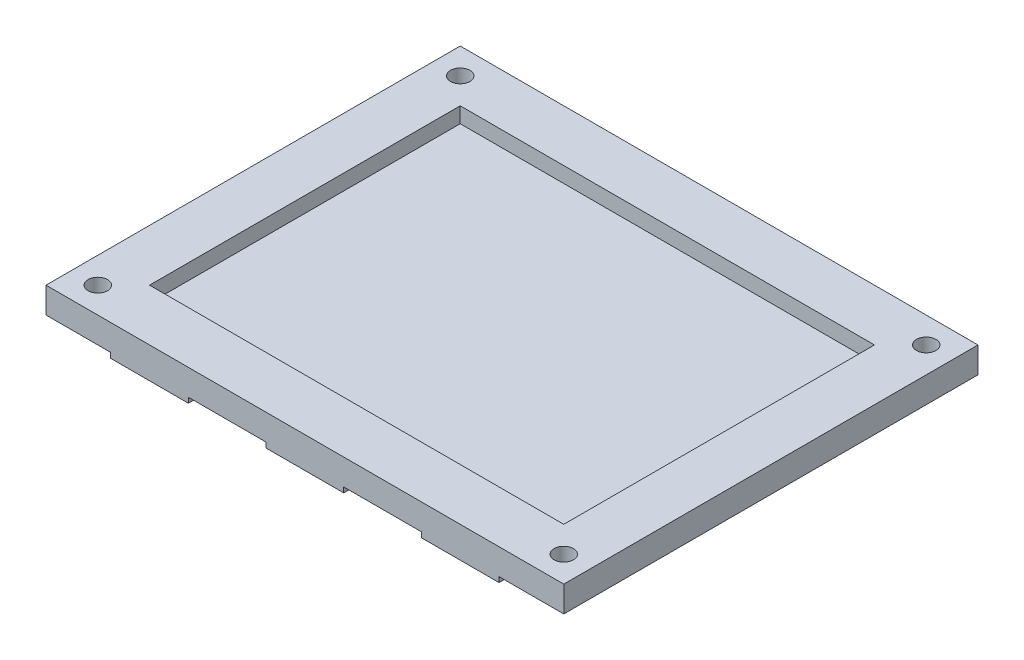
ISO-10303-21;
HEADER;
FILE_DESCRIPTION(('STEP AP214'),'2;1');
FILE_NAME('part.step','',(''),(''),'','','');
FILE_SCHEMA(('AUTOMOTIVE_DESIGN { 1 0 10303 214 1 1 1 1 }'));
ENDSEC;
DATA;
#1=APPLICATION_CONTEXT('core data for automotive mechanical design processes');
#2=APPLICATION_PROTOCOL_DEFINITION('international standard','automotive_design',2000,#1);
#3=PRODUCT_CONTEXT('',#1,'mechanical');
#4=PRODUCT('Part','Part','',(#3));
#5=PRODUCT_RELATED_PRODUCT_CATEGORY('part','',(#4));
#6=PRODUCT_DEFINITION_FORMATION('','',#4);
#7=PRODUCT_DEFINITION_CONTEXT('part definition',#1,'design');
#8=PRODUCT_DEFINITION('design','',#6,#7);
#9=PRODUCT_DEFINITION_SHAPE('','',#8);
#10=(LENGTH_UNIT() NAMED_UNIT(*) SI_UNIT(.MILLI.,.METRE.));
#11=(NAMED_UNIT(*) PLANE_ANGLE_UNIT() SI_UNIT($,.RADIAN.));
#12=(NAMED_UNIT(*) SI_UNIT($,.STERADIAN.) SOLID_ANGLE_UNIT());
#13=UNCERTAINTY_MEASURE_WITH_UNIT(LENGTH_MEASURE(1.E-05),#10,'distance_accuracy_value','');
#14=(GEOMETRIC_REPRESENTATION_CONTEXT(3) GLOBAL_UNCERTAINTY_ASSIGNED_CONTEXT((#13)) GLOBAL_UNIT_ASSIGNED_CONTEXT((#10,
#11,#12)) REPRESENTATION_CONTEXT('',''));
#15=CARTESIAN_POINT('',(0.,0.,0.));
#16=DIRECTION('',(0.,0.,1.));
#17=DIRECTION('',(1.,0.,0.));
#18=AXIS2_PLACEMENT_3D('',#15,#16,#17);
#19=CARTESIAN_POINT('',(0.,0.,0.));
#20=DIRECTION('',(0.,1.,0.));
#21=DIRECTION('',(0.,0.,1.));
#22=AXIS2_PLACEMENT_3D('',#19,#20,#21);
#23=PLANE('',#22);
#24=DIRECTION('',(0.,0.,1.));
#25=VECTOR('',#24,1.);
#26=CARTESIAN_POINT('',(-45.,0.,80.));
#27=LINE('',#26,#25);
#28=CARTESIAN_POINT('',(-45.,0.,-80.));
#29=VERTEX_POINT('',#28);
#30=CARTESIAN_POINT('',(-45.,0.,80.));
#31=VERTEX_POINT('',#30);
#32=EDGE_CURVE('E190',#29,#31,#27,.T.);
#33=ORIENTED_EDGE('',*,*,#32,.F.);
#34=DIRECTION('',(-1.,0.,0.));
#35=VECTOR('',#34,1.);
#36=CARTESIAN_POINT('',(100.,0.,-80.));
#37=LINE('',#36,#35);
#38=CARTESIAN_POINT('',(-15.,0.,-80.));
#39=VERTEX_POINT('',#38);
#40=EDGE_CURVE('E348',#39,#29,#37,.T.);
#41=ORIENTED_EDGE('',*,*,#40,.F.);
#42=DIRECTION('',(0.,0.,-1.));
#43=VECTOR('',#42,1.);
#44=CARTESIAN_POINT('',(-15.,0.,80.));
#45=LINE('',#44,#43);
#46=CARTESIAN_POINT('',(-15.,0.,80.));
#47=VERTEX_POINT('',#46);
#48=EDGE_CURVE('E293',#47,#39,#45,.T.);
#49=ORIENTED_EDGE('',*,*,#48,.F.);
#50=DIRECTION('',(1.,0.,0.));
#51=VECTOR('',#50,1.);
#52=CARTESIAN_POINT('',(100.,0.,80.));
#53=LINE('',#52,#51);
#54=EDGE_CURVE('E197',#31,#47,#53,.T.);
#55=ORIENTED_EDGE('',*,*,#54,.F.);
#56=EDGE_LOOP('',(#33,#41,#49,#55));
#57=FACE_BOUND('',#56,.T.);
#58=ADVANCED_FACE('F36',(#57),#23,.F.);
#59=CARTESIAN_POINT('',(-90.,0.,70.));
#60=DIRECTION('',(0.,1.,0.));
#61=DIRECTION('',(0.,0.,1.));
#62=AXIS2_PLACEMENT_3D('',#59,#60,#61);
#63=CIRCLE('',#62,3.75000000000001);
#64=CARTESIAN_POINT('',(-90.,0.,73.75));
#65=VERTEX_POINT('',#64);
#66=EDGE_CURVE('E273',#65,#65,#63,.T.);
#67=ORIENTED_EDGE('',*,*,#66,.T.);
#68=EDGE_LOOP('',(#67));
#69=FACE_BOUND('',#68,.T.);
#70=CARTESIAN_POINT('',(-90.,0.,-70.));
#71=DIRECTION('',(0.,1.,0.));
#72=DIRECTION('',(0.,0.,1.));
#73=AXIS2_PLACEMENT_3D('',#70,#71,#72);
#74=CIRCLE('',#73,3.75000000000001);
#75=CARTESIAN_POINT('',(-90.,0.,-66.25));
#76=VERTEX_POINT('',#75);
#77=EDGE_CURVE('E262',#76,#76,#74,.T.);
#78=ORIENTED_EDGE('',*,*,#77,.T.);
#79=EDGE_LOOP('',(#78));
#80=FACE_BOUND('',#79,.T.);
#81=DIRECTION('',(0.,0.,-1.));
#82=VECTOR('',#81,1.);
#83=CARTESIAN_POINT('',(-75.,0.,80.));
#84=LINE('',#83,#82);
#85=CARTESIAN_POINT('',(-75.,0.,80.));
#86=VERTEX_POINT('',#85);
#87=CARTESIAN_POINT('',(-75.,0.,-80.));
#88=VERTEX_POINT('',#87);
#89=EDGE_CURVE('E177',#86,#88,#84,.T.);
#90=ORIENTED_EDGE('',*,*,#89,.F.);
#91=CARTESIAN_POINT('',(-100.,0.,80.));
#92=VERTEX_POINT('',#91);
#93=EDGE_CURVE('E188',#92,#86,#53,.T.);
#94=ORIENTED_EDGE('',*,*,#93,.F.);
#95=DIRECTION('',(0.,0.,1.));
#96=VECTOR('',#95,1.);
#97=CARTESIAN_POINT('',(-100.,0.,80.));
#98=LINE('',#97,#96);
#99=CARTESIAN_POINT('',(-100.,0.,-80.));
#100=VERTEX_POINT('',#99);
#101=EDGE_CURVE('E206',#100,#92,#98,.T.);
#102=ORIENTED_EDGE('',*,*,#101,.F.);
#103=EDGE_CURVE('E189',#88,#100,#37,.T.);
#104=ORIENTED_EDGE('',*,*,#103,.F.);
#105=EDGE_LOOP('',(#90,#94,#102,#104));
#106=FACE_BOUND('',#105,.T.);
#107=ADVANCED_FACE('F186',(#69,#80,#106),#23,.F.);
#108=CARTESIAN_POINT('',(90.,0.,70.));
#109=DIRECTION('',(0.,1.,0.));
#110=DIRECTION('',(0.,0.,1.));
#111=AXIS2_PLACEMENT_3D('',#108,#109,#110);
#112=CIRCLE('',#111,3.75000000000001);
#113=CARTESIAN_POINT('',(90.,0.,73.75));
#114=VERTEX_POINT('',#113);
#115=EDGE_CURVE('E276',#114,#114,#112,.T.);
#116=ORIENTED_EDGE('',*,*,#115,.T.);
#117=EDGE_LOOP('',(#116));
#118=FACE_BOUND('',#117,.T.);
#119=CARTESIAN_POINT('',(90.,0.,-70.));
#120=DIRECTION('',(0.,1.,0.));
#121=DIRECTION('',(0.,0.,1.));
#122=AXIS2_PLACEMENT_3D('',#119,#120,#121);
#123=CIRCLE('',#122,3.75000000000001);
#124=CARTESIAN_POINT('',(90.,0.,-66.25));
#125=VERTEX_POINT('',#124);
#126=EDGE_CURVE('E272',#125,#125,#123,.T.);
#127=ORIENTED_EDGE('',*,*,#126,.T.);
#128=EDGE_LOOP('',(#127));
#129=FACE_BOUND('',#128,.T.);
#130=DIRECTION('',(0.,0.,1.));
#131=VECTOR('',#130,1.);
#132=CARTESIAN_POINT('',(75.,0.,80.0000000000004));
#133=LINE('',#132,#131);
#134=CARTESIAN_POINT('',(75.,0.,-79.9999999999996));
#135=VERTEX_POINT('',#134);
#136=CARTESIAN_POINT('',(75.,0.,80.0000000000004));
#137=VERTEX_POINT('',#136);
#138=EDGE_CURVE('E300',#135,#137,#133,.T.);
#139=ORIENTED_EDGE('',*,*,#138,.F.);
#140=CARTESIAN_POINT('',(100.,0.,-80.));
#141=VERTEX_POINT('',#140);
#142=EDGE_CURVE('E227',#141,#135,#37,.T.);
#143=ORIENTED_EDGE('',*,*,#142,.F.);
#144=DIRECTION('',(0.,0.,-1.));
#145=VECTOR('',#144,1.);
#146=CARTESIAN_POINT('',(100.,0.,80.));
#147=LINE('',#146,#145);
#148=CARTESIAN_POINT('',(100.,0.,80.));
#149=VERTEX_POINT('',#148);
#150=EDGE_CURVE('E196',#149,#141,#147,.T.);
#151=ORIENTED_EDGE('',*,*,#150,.F.);
#152=EDGE_CURVE('E201',#137,#149,#53,.T.);
#153=ORIENTED_EDGE('',*,*,#152,.F.);
#154=EDGE_LOOP('',(#139,#143,#151,#153));
#155=FACE_BOUND('',#154,.T.);
#156=ADVANCED_FACE('F365',(#118,#129,#155),#23,.F.);
#157=DIRECTION('',(0.,0.,-1.));
#158=VECTOR('',#157,1.);
#159=CARTESIAN_POINT('',(45.,0.,80.0000000000004));
#160=LINE('',#159,#158);
#161=CARTESIAN_POINT('',(45.,0.,80.0000000000004));
#162=VERTEX_POINT('',#161);
#163=CARTESIAN_POINT('',(45.,0.,-80.));
#164=VERTEX_POINT('',#163);
#165=EDGE_CURVE('E311',#162,#164,#160,.T.);
#166=ORIENTED_EDGE('',*,*,#165,.F.);
#167=CARTESIAN_POINT('',(15.,0.,80.));
#168=VERTEX_POINT('',#167);
#169=EDGE_CURVE('E199',#168,#162,#53,.T.);
#170=ORIENTED_EDGE('',*,*,#169,.F.);
#171=DIRECTION('',(0.,0.,1.));
#172=VECTOR('',#171,1.);
#173=CARTESIAN_POINT('',(15.,0.,80.));
#174=LINE('',#173,#172);
#175=CARTESIAN_POINT('',(15.,0.,-80.));
#176=VERTEX_POINT('',#175);
#177=EDGE_CURVE('E297',#176,#168,#174,.T.);
#178=ORIENTED_EDGE('',*,*,#177,.F.);
#179=EDGE_CURVE('E353',#164,#176,#37,.T.);
#180=ORIENTED_EDGE('',*,*,#179,.F.);
#181=EDGE_LOOP('',(#166,#170,#178,#180));
#182=FACE_BOUND('',#181,.T.);
#183=ADVANCED_FACE('F379',(#182),#23,.F.);
#184=CARTESIAN_POINT('',(-100.,10.,80.));
#185=DIRECTION('',(1.,0.,0.));
#186=DIRECTION('',(0.,0.,-1.));
#187=AXIS2_PLACEMENT_3D('',#184,#185,#186);
#188=PLANE('',#187);
#189=ORIENTED_EDGE('',*,*,#101,.T.);
#190=DIRECTION('',(0.,-1.,0.));
#191=VECTOR('',#190,1.);
#192=CARTESIAN_POINT('',(-100.,10.,80.));
#193=LINE('',#192,#191);
#194=CARTESIAN_POINT('',(-100.,10.,80.));
#195=VERTEX_POINT('',#194);
#196=EDGE_CURVE('E11',#195,#92,#193,.T.);
#197=ORIENTED_EDGE('',*,*,#196,.F.);
#198=DIRECTION('',(0.,0.,1.));
#199=VECTOR('',#198,1.);
#200=CARTESIAN_POINT('',(-100.,10.,80.));
#201=LINE('',#200,#199);
#202=CARTESIAN_POINT('',(-100.,10.,-80.));
#203=VERTEX_POINT('',#202);
#204=EDGE_CURVE('E224',#203,#195,#201,.T.);
#205=ORIENTED_EDGE('',*,*,#204,.F.);
#206=DIRECTION('',(0.,-1.,0.));
#207=VECTOR('',#206,1.);
#208=CARTESIAN_POINT('',(-100.,10.,-80.));
#209=LINE('',#208,#207);
#210=EDGE_CURVE('E219',#203,#100,#209,.T.);
#211=ORIENTED_EDGE('',*,*,#210,.T.);
#212=EDGE_LOOP('',(#189,#197,#205,#211));
#213=FACE_BOUND('',#212,.T.);
#214=ADVANCED_FACE('F38',(#213),#188,.F.);
#215=CARTESIAN_POINT('',(100.,10.,80.));
#216=DIRECTION('',(0.,0.,-1.));
#217=DIRECTION('',(-1.,0.,0.));
#218=AXIS2_PLACEMENT_3D('',#215,#216,#217);
#219=PLANE('',#218);
#220=ORIENTED_EDGE('',*,*,#93,.T.);
#221=DIRECTION('',(0.,1.,0.));
#222=VECTOR('',#221,1.);
#223=CARTESIAN_POINT('',(-75.,-2.,80.));
#224=LINE('',#223,#222);
#225=CARTESIAN_POINT('',(-75.,-2.,80.));
#226=VERTEX_POINT('',#225);
#227=EDGE_CURVE('E174',#226,#86,#224,.T.);
#228=ORIENTED_EDGE('',*,*,#227,.F.);
#229=DIRECTION('',(-1.,0.,0.));
#230=VECTOR('',#229,1.);
#231=CARTESIAN_POINT('',(-75.,-2.,80.));
#232=LINE('',#231,#230);
#233=CARTESIAN_POINT('',(-45.,-2.,80.));
#234=VERTEX_POINT('',#233);
#235=EDGE_CURVE('E331',#234,#226,#232,.T.);
#236=ORIENTED_EDGE('',*,*,#235,.F.);
#237=DIRECTION('',(0.,1.,0.));
#238=VECTOR('',#237,1.);
#239=CARTESIAN_POINT('',(-45.,-2.,80.));
#240=LINE('',#239,#238);
#241=EDGE_CURVE('E183',#234,#31,#240,.T.);
#242=ORIENTED_EDGE('',*,*,#241,.T.);
#243=ORIENTED_EDGE('',*,*,#54,.T.);
#244=DIRECTION('',(0.,1.,0.));
#245=VECTOR('',#244,1.);
#246=CARTESIAN_POINT('',(-15.,-2.,80.));
#247=LINE('',#246,#245);
#248=CARTESIAN_POINT('',(-15.,-2.,80.));
#249=VERTEX_POINT('',#248);
#250=EDGE_CURVE('E283',#249,#47,#247,.T.);
#251=ORIENTED_EDGE('',*,*,#250,.F.);
#252=DIRECTION('',(-1.,0.,0.));
#253=VECTOR('',#252,1.);
#254=CARTESIAN_POINT('',(-15.,-2.,80.));
#255=LINE('',#254,#253);
#256=CARTESIAN_POINT('',(15.,-2.,80.));
#257=VERTEX_POINT('',#256);
#258=EDGE_CURVE('E304',#257,#249,#255,.T.);
#259=ORIENTED_EDGE('',*,*,#258,.F.);
#260=DIRECTION('',(0.,1.,0.));
#261=VECTOR('',#260,1.);
#262=CARTESIAN_POINT('',(15.,-2.,80.));
#263=LINE('',#262,#261);
#264=EDGE_CURVE('E277',#257,#168,#263,.T.);
#265=ORIENTED_EDGE('',*,*,#264,.T.);
#266=ORIENTED_EDGE('',*,*,#169,.T.);
#267=DIRECTION('',(0.,1.,0.));
#268=VECTOR('',#267,1.);
#269=CARTESIAN_POINT('',(45.,-2.,80.0000000000004));
#270=LINE('',#269,#268);
#271=CARTESIAN_POINT('',(45.,-2.,80.0000000000004));
#272=VERTEX_POINT('',#271);
#273=EDGE_CURVE('E321',#272,#162,#270,.T.);
#274=ORIENTED_EDGE('',*,*,#273,.F.);
#275=DIRECTION('',(-1.,0.,0.));
#276=VECTOR('',#275,1.);
#277=CARTESIAN_POINT('',(45.,-2.,80.0000000000004));
#278=LINE('',#277,#276);
#279=CARTESIAN_POINT('',(75.,-2.,80.0000000000004));
#280=VERTEX_POINT('',#279);
#281=EDGE_CURVE('E314',#280,#272,#278,.T.);
#282=ORIENTED_EDGE('',*,*,#281,.F.);
#283=DIRECTION('',(0.,1.,0.));
#284=VECTOR('',#283,1.);
#285=CARTESIAN_POINT('',(75.,-2.,80.0000000000004));
#286=LINE('',#285,#284);
#287=EDGE_CURVE('E323',#280,#137,#286,.T.);
#288=ORIENTED_EDGE('',*,*,#287,.T.);
#289=ORIENTED_EDGE('',*,*,#152,.T.);
#290=DIRECTION('',(0.,-1.,0.));
#291=VECTOR('',#290,1.);
#292=CARTESIAN_POINT('',(100.,10.,80.));
#293=LINE('',#292,#291);
#294=CARTESIAN_POINT('',(100.,10.,80.));
#295=VERTEX_POINT('',#294);
#296=EDGE_CURVE('E44',#295,#149,#293,.T.);
#297=ORIENTED_EDGE('',*,*,#296,.F.);
#298=DIRECTION('',(1.,0.,0.));
#299=VECTOR('',#298,1.);
#300=CARTESIAN_POINT('',(100.,10.,80.));
#301=LINE('',#300,#299);
#302=EDGE_CURVE('E222',#195,#295,#301,.T.);
#303=ORIENTED_EDGE('',*,*,#302,.F.);
#304=ORIENTED_EDGE('',*,*,#196,.T.);
#305=EDGE_LOOP('',(#220,#228,#236,#242,#243,#251,#259,#265,#266,#274,#282,#288,#289,#297,#303,#304));
#306=FACE_BOUND('',#305,.T.);
#307=ADVANCED_FACE('F193',(#306),#219,.F.);
#308=CARTESIAN_POINT('',(100.,10.,80.));
#309=DIRECTION('',(-1.,0.,0.));
#310=DIRECTION('',(0.,0.,1.));
#311=AXIS2_PLACEMENT_3D('',#308,#309,#310);
#312=PLANE('',#311);
#313=ORIENTED_EDGE('',*,*,#150,.T.);
#314=DIRECTION('',(0.,-1.,0.));
#315=VECTOR('',#314,1.);
#316=CARTESIAN_POINT('',(100.,10.,-80.));
#317=LINE('',#316,#315);
#318=CARTESIAN_POINT('',(100.,10.,-80.));
#319=VERTEX_POINT('',#318);
#320=EDGE_CURVE('E361',#319,#141,#317,.T.);
#321=ORIENTED_EDGE('',*,*,#320,.F.);
#322=DIRECTION('',(0.,0.,-1.));
#323=VECTOR('',#322,1.);
#324=CARTESIAN_POINT('',(100.,10.,80.));
#325=LINE('',#324,#323);
#326=EDGE_CURVE('E220',#295,#319,#325,.T.);
#327=ORIENTED_EDGE('',*,*,#326,.F.);
#328=ORIENTED_EDGE('',*,*,#296,.T.);
#329=EDGE_LOOP('',(#313,#321,#327,#328));
#330=FACE_BOUND('',#329,.T.);
#331=ADVANCED_FACE('F459',(#330),#312,.F.);
#332=CARTESIAN_POINT('',(100.,10.,-80.));
#333=DIRECTION('',(0.,0.,1.));
#334=DIRECTION('',(1.,0.,0.));
#335=AXIS2_PLACEMENT_3D('',#332,#333,#334);
#336=PLANE('',#335);
#337=ORIENTED_EDGE('',*,*,#142,.T.);
#338=DIRECTION('',(0.,1.,0.));
#339=VECTOR('',#338,1.);
#340=CARTESIAN_POINT('',(75.,-2.,-79.9999999999996));
#341=LINE('',#340,#339);
#342=CARTESIAN_POINT('',(75.,-2.,-79.9999999999996));
#343=VERTEX_POINT('',#342);
#344=EDGE_CURVE('E325',#343,#135,#341,.T.);
#345=ORIENTED_EDGE('',*,*,#344,.F.);
#346=DIRECTION('',(1.,0.,0.));
#347=VECTOR('',#346,1.);
#348=CARTESIAN_POINT('',(45.,-2.,-79.9999999999996));
#349=LINE('',#348,#347);
#350=CARTESIAN_POINT('',(45.,-2.,-79.9999999999996));
#351=VERTEX_POINT('',#350);
#352=EDGE_CURVE('E308',#351,#343,#349,.T.);
#353=ORIENTED_EDGE('',*,*,#352,.F.);
#354=DIRECTION('',(0.,1.,0.));
#355=VECTOR('',#354,1.);
#356=CARTESIAN_POINT('',(45.,-2.,-79.9999999999996));
#357=LINE('',#356,#355);
#358=EDGE_CURVE('E58',#351,#164,#357,.T.);
#359=ORIENTED_EDGE('',*,*,#358,.T.);
#360=ORIENTED_EDGE('',*,*,#179,.T.);
#361=DIRECTION('',(0.,1.,0.));
#362=VECTOR('',#361,1.);
#363=CARTESIAN_POINT('',(15.,-2.,-80.));
#364=LINE('',#363,#362);
#365=CARTESIAN_POINT('',(15.,-2.,-80.));
#366=VERTEX_POINT('',#365);
#367=EDGE_CURVE('E289',#366,#176,#364,.T.);
#368=ORIENTED_EDGE('',*,*,#367,.F.);
#369=DIRECTION('',(1.,0.,0.));
#370=VECTOR('',#369,1.);
#371=CARTESIAN_POINT('',(-15.,-2.,-80.));
#372=LINE('',#371,#370);
#373=CARTESIAN_POINT('',(-15.,-2.,-80.));
#374=VERTEX_POINT('',#373);
#375=EDGE_CURVE('E292',#374,#366,#372,.T.);
#376=ORIENTED_EDGE('',*,*,#375,.F.);
#377=DIRECTION('',(0.,1.,0.));
#378=VECTOR('',#377,1.);
#379=CARTESIAN_POINT('',(-15.,-2.,-80.));
#380=LINE('',#379,#378);
#381=EDGE_CURVE('E286',#374,#39,#380,.T.);
#382=ORIENTED_EDGE('',*,*,#381,.T.);
#383=ORIENTED_EDGE('',*,*,#40,.T.);
#384=DIRECTION('',(0.,1.,0.));
#385=VECTOR('',#384,1.);
#386=CARTESIAN_POINT('',(-45.,-2.,-80.));
#387=LINE('',#386,#385);
#388=CARTESIAN_POINT('',(-45.,-2.,-80.));
#389=VERTEX_POINT('',#388);
#390=EDGE_CURVE('E338',#389,#29,#387,.T.);
#391=ORIENTED_EDGE('',*,*,#390,.F.);
#392=DIRECTION('',(1.,0.,0.));
#393=VECTOR('',#392,1.);
#394=CARTESIAN_POINT('',(-75.,-2.,-80.));
#395=LINE('',#394,#393);
#396=CARTESIAN_POINT('',(-75.,-2.,-80.));
#397=VERTEX_POINT('',#396);
#398=EDGE_CURVE('E191',#397,#389,#395,.T.);
#399=ORIENTED_EDGE('',*,*,#398,.F.);
#400=DIRECTION('',(0.,1.,0.));
#401=VECTOR('',#400,1.);
#402=CARTESIAN_POINT('',(-75.,-2.,-80.));
#403=LINE('',#402,#401);
#404=EDGE_CURVE('E51',#397,#88,#403,.T.);
#405=ORIENTED_EDGE('',*,*,#404,.T.);
#406=ORIENTED_EDGE('',*,*,#103,.T.);
#407=ORIENTED_EDGE('',*,*,#210,.F.);
#408=DIRECTION('',(-1.,0.,0.));
#409=VECTOR('',#408,1.);
#410=CARTESIAN_POINT('',(100.,10.,-80.));
#411=LINE('',#410,#409);
#412=EDGE_CURVE('E217',#319,#203,#411,.T.);
#413=ORIENTED_EDGE('',*,*,#412,.F.);
#414=ORIENTED_EDGE('',*,*,#320,.T.);
#415=EDGE_LOOP('',(#337,#345,#353,#359,#360,#368,#376,#382,#383,#391,#399,#405,#406,#407,#413,#414));
#416=FACE_BOUND('',#415,.T.);
#417=ADVANCED_FACE('F350',(#416),#336,.F.);
#418=CARTESIAN_POINT('',(0.,10.,0.));
#419=DIRECTION('',(0.,1.,0.));
#420=DIRECTION('',(0.,0.,1.));
#421=AXIS2_PLACEMENT_3D('',#418,#419,#420);
#422=PLANE('',#421);
#423=CARTESIAN_POINT('',(90.,10.,70.));
#424=DIRECTION('',(0.,1.,0.));
#425=DIRECTION('',(0.,0.,1.));
#426=AXIS2_PLACEMENT_3D('',#423,#424,#425);
#427=CIRCLE('',#426,3.75000000000001);
#428=CARTESIAN_POINT('',(90.,10.,73.75));
#429=VERTEX_POINT('',#428);
#430=EDGE_CURVE('E258',#429,#429,#427,.T.);
#431=ORIENTED_EDGE('',*,*,#430,.F.);
#432=EDGE_LOOP('',(#431));
#433=FACE_BOUND('',#432,.T.);
#434=CARTESIAN_POINT('',(90.,10.,-70.));
#435=DIRECTION('',(0.,1.,0.));
#436=DIRECTION('',(0.,0.,1.));
#437=AXIS2_PLACEMENT_3D('',#434,#435,#436);
#438=CIRCLE('',#437,3.75000000000001);
#439=CARTESIAN_POINT('',(90.,10.,-66.25));
#440=VERTEX_POINT('',#439);
#441=EDGE_CURVE('E261',#440,#440,#438,.T.);
#442=ORIENTED_EDGE('',*,*,#441,.F.);
#443=EDGE_LOOP('',(#442));
#444=FACE_BOUND('',#443,.T.);
#445=CARTESIAN_POINT('',(-90.,10.,70.));
#446=DIRECTION('',(0.,1.,0.));
#447=DIRECTION('',(0.,0.,1.));
#448=AXIS2_PLACEMENT_3D('',#445,#446,#447);
#449=CIRCLE('',#448,3.75000000000001);
#450=CARTESIAN_POINT('',(-90.,10.,73.75));
#451=VERTEX_POINT('',#450);
#452=EDGE_CURVE('E265',#451,#451,#449,.T.);
#453=ORIENTED_EDGE('',*,*,#452,.F.);
#454=EDGE_LOOP('',(#453));
#455=FACE_BOUND('',#454,.T.);
#456=CARTESIAN_POINT('',(-90.,10.,-70.));
#457=DIRECTION('',(0.,1.,0.));
#458=DIRECTION('',(0.,0.,1.));
#459=AXIS2_PLACEMENT_3D('',#456,#457,#458);
#460=CIRCLE('',#459,3.75000000000001);
#461=CARTESIAN_POINT('',(-90.,10.,-66.25));
#462=VERTEX_POINT('',#461);
#463=EDGE_CURVE('E247',#462,#462,#460,.T.);
#464=ORIENTED_EDGE('',*,*,#463,.F.);
#465=EDGE_LOOP('',(#464));
#466=FACE_BOUND('',#465,.T.);
#467=DIRECTION('',(0.,0.,-1.));
#468=VECTOR('',#467,1.);
#469=CARTESIAN_POINT('',(80.,10.,-60.));
#470=LINE('',#469,#468);
#471=CARTESIAN_POINT('',(80.,10.,60.));
#472=VERTEX_POINT('',#471);
#473=CARTESIAN_POINT('',(80.,10.,-60.));
#474=VERTEX_POINT('',#473);
#475=EDGE_CURVE('E245',#472,#474,#470,.T.);
#476=ORIENTED_EDGE('',*,*,#475,.F.);
#477=DIRECTION('',(1.,0.,0.));
#478=VECTOR('',#477,1.);
#479=CARTESIAN_POINT('',(-80.,10.,60.));
#480=LINE('',#479,#478);
#481=CARTESIAN_POINT('',(-80.,10.,60.));
#482=VERTEX_POINT('',#481);
#483=EDGE_CURVE('E235',#482,#472,#480,.T.);
#484=ORIENTED_EDGE('',*,*,#483,.F.);
#485=DIRECTION('',(0.,0.,1.));
#486=VECTOR('',#485,1.);
#487=CARTESIAN_POINT('',(-80.,10.,-60.));
#488=LINE('',#487,#486);
#489=CARTESIAN_POINT('',(-80.,10.,-60.));
#490=VERTEX_POINT('',#489);
#491=EDGE_CURVE('E239',#490,#482,#488,.T.);
#492=ORIENTED_EDGE('',*,*,#491,.F.);
#493=DIRECTION('',(-1.,0.,0.));
#494=VECTOR('',#493,1.);
#495=CARTESIAN_POINT('',(-80.,10.,-60.));
#496=LINE('',#495,#494);
#497=EDGE_CURVE('E242',#474,#490,#496,.T.);
#498=ORIENTED_EDGE('',*,*,#497,.F.);
#499=EDGE_LOOP('',(#476,#484,#492,#498));
#500=FACE_BOUND('',#499,.T.);
#501=ORIENTED_EDGE('',*,*,#204,.T.);
#502=ORIENTED_EDGE('',*,*,#302,.T.);
#503=ORIENTED_EDGE('',*,*,#326,.T.);
#504=ORIENTED_EDGE('',*,*,#412,.T.);
#505=EDGE_LOOP('',(#501,#502,#503,#504));
#506=FACE_BOUND('',#505,.T.);
#507=ADVANCED_FACE('F452',(#433,#444,#455,#466,#500,#506),#422,.T.);
#508=CARTESIAN_POINT('',(80.,4.,-60.));
#509=DIRECTION('',(1.,0.,0.));
#510=DIRECTION('',(0.,0.,-1.));
#511=AXIS2_PLACEMENT_3D('',#508,#509,#510);
#512=PLANE('',#511);
#513=ORIENTED_EDGE('',*,*,#475,.T.);
#514=DIRECTION('',(0.,1.,0.));
#515=VECTOR('',#514,1.);
#516=CARTESIAN_POINT('',(80.,4.,-60.));
#517=LINE('',#516,#515);
#518=CARTESIAN_POINT('',(80.,4.,-60.));
#519=VERTEX_POINT('',#518);
#520=EDGE_CURVE('E228',#519,#474,#517,.T.);
#521=ORIENTED_EDGE('',*,*,#520,.F.);
#522=DIRECTION('',(0.,0.,-1.));
#523=VECTOR('',#522,1.);
#524=CARTESIAN_POINT('',(80.,4.,-60.));
#525=LINE('',#524,#523);
#526=CARTESIAN_POINT('',(80.,4.,60.));
#527=VERTEX_POINT('',#526);
#528=EDGE_CURVE('E238',#527,#519,#525,.T.);
#529=ORIENTED_EDGE('',*,*,#528,.F.);
#530=DIRECTION('',(0.,1.,0.));
#531=VECTOR('',#530,1.);
#532=CARTESIAN_POINT('',(80.,4.,60.));
#533=LINE('',#532,#531);
#534=EDGE_CURVE('E211',#527,#472,#533,.T.);
#535=ORIENTED_EDGE('',*,*,#534,.T.);
#536=EDGE_LOOP('',(#513,#521,#529,#535));
#537=FACE_BOUND('',#536,.T.);
#538=ADVANCED_FACE('F443',(#537),#512,.F.);
#539=CARTESIAN_POINT('',(-80.,4.,60.));
#540=DIRECTION('',(0.,0.,1.));
#541=DIRECTION('',(1.,0.,0.));
#542=AXIS2_PLACEMENT_3D('',#539,#540,#541);
#543=PLANE('',#542);
#544=ORIENTED_EDGE('',*,*,#483,.T.);
#545=ORIENTED_EDGE('',*,*,#534,.F.);
#546=DIRECTION('',(1.,0.,0.));
#547=VECTOR('',#546,1.);
#548=CARTESIAN_POINT('',(-80.,4.,60.));
#549=LINE('',#548,#547);
#550=CARTESIAN_POINT('',(-80.,4.,60.));
#551=VERTEX_POINT('',#550);
#552=EDGE_CURVE('E232',#551,#527,#549,.T.);
#553=ORIENTED_EDGE('',*,*,#552,.F.);
#554=DIRECTION('',(0.,1.,0.));
#555=VECTOR('',#554,1.);
#556=CARTESIAN_POINT('',(-80.,4.,60.));
#557=LINE('',#556,#555);
#558=EDGE_CURVE('E214',#551,#482,#557,.T.);
#559=ORIENTED_EDGE('',*,*,#558,.T.);
#560=EDGE_LOOP('',(#544,#545,#553,#559));
#561=FACE_BOUND('',#560,.T.);
#562=ADVANCED_FACE('F439',(#561),#543,.F.);
#563=CARTESIAN_POINT('',(-80.,4.,-60.));
#564=DIRECTION('',(-1.,0.,0.));
#565=DIRECTION('',(0.,0.,1.));
#566=AXIS2_PLACEMENT_3D('',#563,#564,#565);
#567=PLANE('',#566);
#568=ORIENTED_EDGE('',*,*,#491,.T.);
#569=ORIENTED_EDGE('',*,*,#558,.F.);
#570=DIRECTION('',(0.,0.,1.));
#571=VECTOR('',#570,1.);
#572=CARTESIAN_POINT('',(-80.,4.,-60.));
#573=LINE('',#572,#571);
#574=CARTESIAN_POINT('',(-80.,4.,-60.));
#575=VERTEX_POINT('',#574);
#576=EDGE_CURVE('E250',#575,#551,#573,.T.);
#577=ORIENTED_EDGE('',*,*,#576,.F.);
#578=DIRECTION('',(0.,1.,0.));
#579=VECTOR('',#578,1.);
#580=CARTESIAN_POINT('',(-80.,4.,-60.));
#581=LINE('',#580,#579);
#582=EDGE_CURVE('E231',#575,#490,#581,.T.);
#583=ORIENTED_EDGE('',*,*,#582,.T.);
#584=EDGE_LOOP('',(#568,#569,#577,#583));
#585=FACE_BOUND('',#584,.T.);
#586=ADVANCED_FACE('F442',(#585),#567,.F.);
#587=CARTESIAN_POINT('',(-80.,4.,-60.));
#588=DIRECTION('',(0.,0.,-1.));
#589=DIRECTION('',(-1.,0.,0.));
#590=AXIS2_PLACEMENT_3D('',#587,#588,#589);
#591=PLANE('',#590);
#592=ORIENTED_EDGE('',*,*,#497,.T.);
#593=ORIENTED_EDGE('',*,*,#582,.F.);
#594=DIRECTION('',(-1.,0.,0.));
#595=VECTOR('',#594,1.);
#596=CARTESIAN_POINT('',(-80.,4.,-60.));
#597=LINE('',#596,#595);
#598=EDGE_CURVE('E253',#519,#575,#597,.T.);
#599=ORIENTED_EDGE('',*,*,#598,.F.);
#600=ORIENTED_EDGE('',*,*,#520,.T.);
#601=EDGE_LOOP('',(#592,#593,#599,#600));
#602=FACE_BOUND('',#601,.T.);
#603=ADVANCED_FACE('F437',(#602),#591,.F.);
#604=CARTESIAN_POINT('',(0.,4.,0.));
#605=DIRECTION('',(0.,1.,0.));
#606=DIRECTION('',(0.,0.,1.));
#607=AXIS2_PLACEMENT_3D('',#604,#605,#606);
#608=PLANE('',#607);
#609=ORIENTED_EDGE('',*,*,#528,.T.);
#610=ORIENTED_EDGE('',*,*,#598,.T.);
#611=ORIENTED_EDGE('',*,*,#576,.T.);
#612=ORIENTED_EDGE('',*,*,#552,.T.);
#613=EDGE_LOOP('',(#609,#610,#611,#612));
#614=FACE_BOUND('',#613,.T.);
#615=ADVANCED_FACE('F434',(#614),#608,.T.);
#616=CARTESIAN_POINT('',(-90.,4.,-70.));
#617=DIRECTION('',(0.,1.,0.));
#618=DIRECTION('',(0.,0.,1.));
#619=AXIS2_PLACEMENT_3D('',#616,#617,#618);
#620=CYLINDRICAL_SURFACE('',#619,3.75000000000001);
#621=ORIENTED_EDGE('',*,*,#463,.T.);
#622=EDGE_LOOP('',(#621));
#623=FACE_BOUND('',#622,.T.);
#624=ORIENTED_EDGE('',*,*,#77,.F.);
#625=EDGE_LOOP('',(#624));
#626=FACE_BOUND('',#625,.T.);
#627=ADVANCED_FACE('F429',(#623,#626),#620,.F.);
#628=CARTESIAN_POINT('',(-90.,4.,70.));
#629=DIRECTION('',(0.,1.,0.));
#630=DIRECTION('',(0.,0.,1.));
#631=AXIS2_PLACEMENT_3D('',#628,#629,#630);
#632=CYLINDRICAL_SURFACE('',#631,3.75000000000001);
#633=ORIENTED_EDGE('',*,*,#452,.T.);
#634=EDGE_LOOP('',(#633));
#635=FACE_BOUND('',#634,.T.);
#636=ORIENTED_EDGE('',*,*,#66,.F.);
#637=EDGE_LOOP('',(#636));
#638=FACE_BOUND('',#637,.T.);
#639=ADVANCED_FACE('F420',(#635,#638),#632,.F.);
#640=CARTESIAN_POINT('',(90.,4.,-70.));
#641=DIRECTION('',(0.,1.,0.));
#642=DIRECTION('',(0.,0.,1.));
#643=AXIS2_PLACEMENT_3D('',#640,#641,#642);
#644=CYLINDRICAL_SURFACE('',#643,3.75000000000001);
#645=ORIENTED_EDGE('',*,*,#441,.T.);
#646=EDGE_LOOP('',(#645));
#647=FACE_BOUND('',#646,.T.);
#648=ORIENTED_EDGE('',*,*,#126,.F.);
#649=EDGE_LOOP('',(#648));
#650=FACE_BOUND('',#649,.T.);
#651=ADVANCED_FACE('F417',(#647,#650),#644,.F.);
#652=CARTESIAN_POINT('',(90.,4.,70.));
#653=DIRECTION('',(0.,1.,0.));
#654=DIRECTION('',(0.,0.,1.));
#655=AXIS2_PLACEMENT_3D('',#652,#653,#654);
#656=CYLINDRICAL_SURFACE('',#655,3.75000000000001);
#657=ORIENTED_EDGE('',*,*,#430,.T.);
#658=EDGE_LOOP('',(#657));
#659=FACE_BOUND('',#658,.T.);
#660=ORIENTED_EDGE('',*,*,#115,.F.);
#661=EDGE_LOOP('',(#660));
#662=FACE_BOUND('',#661,.T.);
#663=ADVANCED_FACE('F419',(#659,#662),#656,.F.);
#664=CARTESIAN_POINT('',(15.,-2.,80.));
#665=DIRECTION('',(-1.,0.,0.));
#666=DIRECTION('',(0.,0.,1.));
#667=AXIS2_PLACEMENT_3D('',#664,#665,#666);
#668=PLANE('',#667);
#669=ORIENTED_EDGE('',*,*,#177,.T.);
#670=ORIENTED_EDGE('',*,*,#264,.F.);
#671=DIRECTION('',(0.,0.,1.));
#672=VECTOR('',#671,1.);
#673=CARTESIAN_POINT('',(15.,-2.,80.));
#674=LINE('',#673,#672);
#675=EDGE_CURVE('E296',#366,#257,#674,.T.);
#676=ORIENTED_EDGE('',*,*,#675,.F.);
#677=ORIENTED_EDGE('',*,*,#367,.T.);
#678=EDGE_LOOP('',(#669,#670,#676,#677));
#679=FACE_BOUND('',#678,.T.);
#680=ADVANCED_FACE('F384',(#679),#668,.F.);
#681=CARTESIAN_POINT('',(-15.,-2.,80.));
#682=DIRECTION('',(1.,0.,0.));
#683=DIRECTION('',(0.,0.,-1.));
#684=AXIS2_PLACEMENT_3D('',#681,#682,#683);
#685=PLANE('',#684);
#686=ORIENTED_EDGE('',*,*,#48,.T.);
#687=ORIENTED_EDGE('',*,*,#381,.F.);
#688=DIRECTION('',(0.,0.,-1.));
#689=VECTOR('',#688,1.);
#690=CARTESIAN_POINT('',(-15.,-2.,80.));
#691=LINE('',#690,#689);
#692=EDGE_CURVE('E302',#249,#374,#691,.T.);
#693=ORIENTED_EDGE('',*,*,#692,.F.);
#694=ORIENTED_EDGE('',*,*,#250,.T.);
#695=EDGE_LOOP('',(#686,#687,#693,#694));
#696=FACE_BOUND('',#695,.T.);
#697=ADVANCED_FACE('F390',(#696),#685,.F.);
#698=CARTESIAN_POINT('',(0.,-2.,0.));
#699=DIRECTION('',(0.,-1.,0.));
#700=DIRECTION('',(0.,0.,-1.));
#701=AXIS2_PLACEMENT_3D('',#698,#699,#700);
#702=PLANE('',#701);
#703=ORIENTED_EDGE('',*,*,#675,.T.);
#704=ORIENTED_EDGE('',*,*,#258,.T.);
#705=ORIENTED_EDGE('',*,*,#692,.T.);
#706=ORIENTED_EDGE('',*,*,#375,.T.);
#707=EDGE_LOOP('',(#703,#704,#705,#706));
#708=FACE_BOUND('',#707,.T.);
#709=ADVANCED_FACE('F386',(#708),#702,.T.);
#710=CARTESIAN_POINT('',(75.,-2.,80.0000000000004));
#711=DIRECTION('',(-1.,0.,0.));
#712=DIRECTION('',(0.,0.,1.));
#713=AXIS2_PLACEMENT_3D('',#710,#711,#712);
#714=PLANE('',#713);
#715=ORIENTED_EDGE('',*,*,#138,.T.);
#716=ORIENTED_EDGE('',*,*,#287,.F.);
#717=DIRECTION('',(0.,0.,1.));
#718=VECTOR('',#717,1.);
#719=CARTESIAN_POINT('',(75.,-2.,80.0000000000004));
#720=LINE('',#719,#718);
#721=EDGE_CURVE('E312',#343,#280,#720,.T.);
#722=ORIENTED_EDGE('',*,*,#721,.F.);
#723=ORIENTED_EDGE('',*,*,#344,.T.);
#724=EDGE_LOOP('',(#715,#716,#722,#723));
#725=FACE_BOUND('',#724,.T.);
#726=ADVANCED_FACE('F368',(#725),#714,.F.);
#727=CARTESIAN_POINT('',(45.,-2.,80.0000000000004));
#728=DIRECTION('',(1.,0.,0.));
#729=DIRECTION('',(0.,0.,-1.));
#730=AXIS2_PLACEMENT_3D('',#727,#728,#729);
#731=PLANE('',#730);
#732=ORIENTED_EDGE('',*,*,#165,.T.);
#733=ORIENTED_EDGE('',*,*,#358,.F.);
#734=DIRECTION('',(0.,0.,-1.));
#735=VECTOR('',#734,1.);
#736=CARTESIAN_POINT('',(45.,-2.,80.0000000000004));
#737=LINE('',#736,#735);
#738=EDGE_CURVE('E316',#272,#351,#737,.T.);
#739=ORIENTED_EDGE('',*,*,#738,.F.);
#740=ORIENTED_EDGE('',*,*,#273,.T.);
#741=EDGE_LOOP('',(#732,#733,#739,#740));
#742=FACE_BOUND('',#741,.T.);
#743=ADVANCED_FACE('F374',(#742),#731,.F.);
#744=CARTESIAN_POINT('',(0.,-2.,0.));
#745=DIRECTION('',(0.,1.,0.));
#746=DIRECTION('',(0.,0.,1.));
#747=AXIS2_PLACEMENT_3D('',#744,#745,#746);
#748=PLANE('',#747);
#749=ORIENTED_EDGE('',*,*,#352,.T.);
#750=ORIENTED_EDGE('',*,*,#721,.T.);
#751=ORIENTED_EDGE('',*,*,#281,.T.);
#752=ORIENTED_EDGE('',*,*,#738,.T.);
#753=EDGE_LOOP('',(#749,#750,#751,#752));
#754=FACE_BOUND('',#753,.T.);
#755=ADVANCED_FACE('F372',(#754),#748,.F.);
#756=CARTESIAN_POINT('',(-45.,-2.,80.));
#757=DIRECTION('',(-1.,0.,0.));
#758=DIRECTION('',(0.,0.,1.));
#759=AXIS2_PLACEMENT_3D('',#756,#757,#758);
#760=PLANE('',#759);
#761=ORIENTED_EDGE('',*,*,#32,.T.);
#762=ORIENTED_EDGE('',*,*,#241,.F.);
#763=DIRECTION('',(0.,0.,1.));
#764=VECTOR('',#763,1.);
#765=CARTESIAN_POINT('',(-45.,-2.,80.));
#766=LINE('',#765,#764);
#767=EDGE_CURVE('E329',#389,#234,#766,.T.);
#768=ORIENTED_EDGE('',*,*,#767,.F.);
#769=ORIENTED_EDGE('',*,*,#390,.T.);
#770=EDGE_LOOP('',(#761,#762,#768,#769));
#771=FACE_BOUND('',#770,.T.);
#772=ADVANCED_FACE('F342',(#771),#760,.F.);
#773=CARTESIAN_POINT('',(-75.,-2.,80.));
#774=DIRECTION('',(1.,0.,0.));
#775=DIRECTION('',(0.,0.,-1.));
#776=AXIS2_PLACEMENT_3D('',#773,#774,#775);
#777=PLANE('',#776);
#778=ORIENTED_EDGE('',*,*,#89,.T.);
#779=ORIENTED_EDGE('',*,*,#404,.F.);
#780=DIRECTION('',(0.,0.,-1.));
#781=VECTOR('',#780,1.);
#782=CARTESIAN_POINT('',(-75.,-2.,80.));
#783=LINE('',#782,#781);
#784=EDGE_CURVE('E179',#226,#397,#783,.T.);
#785=ORIENTED_EDGE('',*,*,#784,.F.);
#786=ORIENTED_EDGE('',*,*,#227,.T.);
#787=EDGE_LOOP('',(#778,#779,#785,#786));
#788=FACE_BOUND('',#787,.T.);
#789=ADVANCED_FACE('F176',(#788),#777,.F.);
#790=CARTESIAN_POINT('',(0.,-2.,0.));
#791=DIRECTION('',(0.,1.,0.));
#792=DIRECTION('',(0.,0.,1.));
#793=AXIS2_PLACEMENT_3D('',#790,#791,#792);
#794=PLANE('',#793);
#795=ORIENTED_EDGE('',*,*,#398,.T.);
#796=ORIENTED_EDGE('',*,*,#767,.T.);
#797=ORIENTED_EDGE('',*,*,#235,.T.);
#798=ORIENTED_EDGE('',*,*,#784,.T.);
#799=EDGE_LOOP('',(#795,#796,#797,#798));
#800=FACE_BOUND('',#799,.T.);
#801=ADVANCED_FACE('F392',(#800),#794,.F.);
#802=CLOSED_SHELL('',(#58,#107,#156,#183,#214,#307,#331,#417,#507,#538,#562,#586,#603,#615,#627,
#639,#651,#663,#680,#697,#709,#726,#743,#755,#772,#789,#801));
#803=MANIFOLD_SOLID_BREP('B2',#802);
#804=ADVANCED_BREP_SHAPE_REPRESENTATION('',(#18,#803),#14);
#805=SHAPE_DEFINITION_REPRESENTATION(#9,#804);
ENDSEC;
END-ISO-10303-21;
